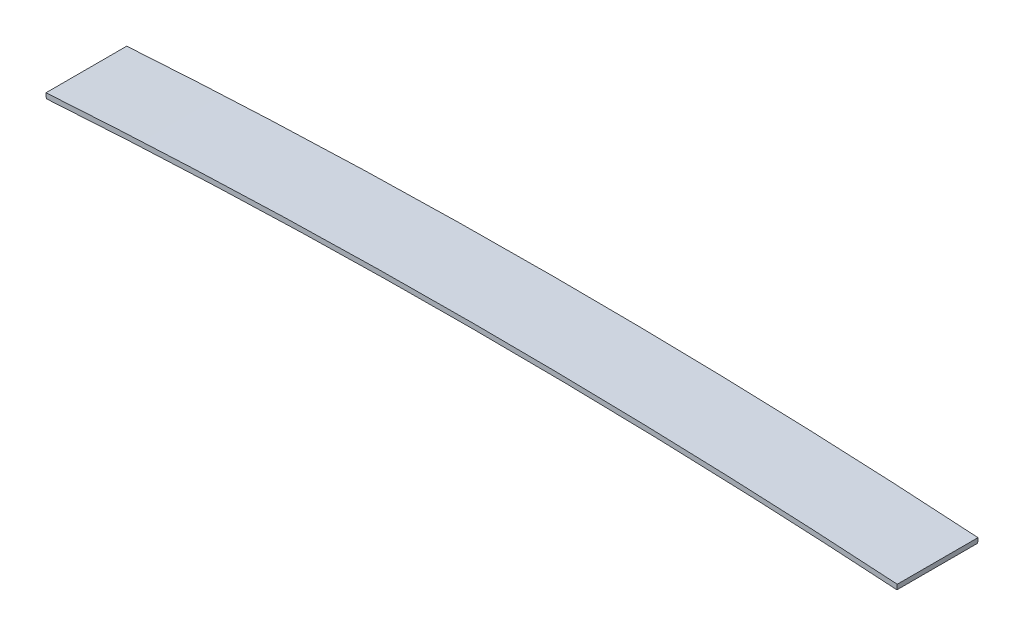
ISO-10303-21;
HEADER;
FILE_DESCRIPTION(('STEP AP214'),'2;1');
FILE_NAME('part.step','',(''),(''),'','','');
FILE_SCHEMA(('AUTOMOTIVE_DESIGN { 1 0 10303 214 1 1 1 1 }'));
ENDSEC;
DATA;
#1=APPLICATION_CONTEXT('core data for automotive mechanical design processes');
#2=APPLICATION_PROTOCOL_DEFINITION('international standard','automotive_design',2000,#1);
#3=PRODUCT_CONTEXT('',#1,'mechanical');
#4=PRODUCT('Part','Part','',(#3));
#5=PRODUCT_RELATED_PRODUCT_CATEGORY('part','',(#4));
#6=PRODUCT_DEFINITION_FORMATION('','',#4);
#7=PRODUCT_DEFINITION_CONTEXT('part definition',#1,'design');
#8=PRODUCT_DEFINITION('design','',#6,#7);
#9=PRODUCT_DEFINITION_SHAPE('','',#8);
#10=(LENGTH_UNIT() NAMED_UNIT(*) SI_UNIT(.MILLI.,.METRE.));
#11=(NAMED_UNIT(*) PLANE_ANGLE_UNIT() SI_UNIT($,.RADIAN.));
#12=(NAMED_UNIT(*) SI_UNIT($,.STERADIAN.) SOLID_ANGLE_UNIT());
#13=UNCERTAINTY_MEASURE_WITH_UNIT(LENGTH_MEASURE(1.E-05),#10,'distance_accuracy_value','');
#14=(GEOMETRIC_REPRESENTATION_CONTEXT(3) GLOBAL_UNCERTAINTY_ASSIGNED_CONTEXT((#13)) GLOBAL_UNIT_ASSIGNED_CONTEXT((#10,
#11,#12)) REPRESENTATION_CONTEXT('',''));
#15=CARTESIAN_POINT('',(0.,0.,0.));
#16=DIRECTION('',(0.,0.,1.));
#17=DIRECTION('',(1.,0.,0.));
#18=AXIS2_PLACEMENT_3D('',#15,#16,#17);
#19=CARTESIAN_POINT('',(0.,0.,-8.));
#20=CARTESIAN_POINT('',(28.099304307425,1.84237579528462,-8.));
#21=CARTESIAN_POINT('',(56.1984685840656,1.8423757953029,-8.));
#22=CARTESIAN_POINT('',(84.2977728915,0.,-8.));
#23=B_SPLINE_CURVE_WITH_KNOTS('',3,(#19,#20,#21,#22),.UNSPECIFIED.,.F.,.F.,(4,4),(0.,1.),.UNSPECIFIED.);
#24=DIRECTION('',(0.,0.,1.));
#25=VECTOR('',#24,1.);
#26=SURFACE_OF_LINEAR_EXTRUSION('',#23,#25);
#27=CARTESIAN_POINT('',(0.,0.,0.));
#28=CARTESIAN_POINT('',(28.099304307425,1.84237579528462,0.));
#29=CARTESIAN_POINT('',(56.1984685840656,1.8423757953029,0.));
#30=CARTESIAN_POINT('',(84.2977728915,0.,0.));
#31=B_SPLINE_CURVE_WITH_KNOTS('',3,(#27,#28,#29,#30),.UNSPECIFIED.,.F.,.F.,(4,4),(0.,1.),.UNSPECIFIED.);
#32=CARTESIAN_POINT('',(0.,0.,0.));
#33=VERTEX_POINT('',#32);
#34=CARTESIAN_POINT('',(84.2977728915,0.,0.));
#35=VERTEX_POINT('',#34);
#36=EDGE_CURVE('E124',#33,#35,#31,.T.);
#37=ORIENTED_EDGE('',*,*,#36,.F.);
#38=DIRECTION('',(0.,0.,1.));
#39=VECTOR('',#38,1.);
#40=CARTESIAN_POINT('',(0.,0.,-8.));
#41=LINE('',#40,#39);
#42=CARTESIAN_POINT('',(0.,0.,-8.));
#43=VERTEX_POINT('',#42);
#44=EDGE_CURVE('E11',#43,#33,#41,.T.);
#45=ORIENTED_EDGE('',*,*,#44,.F.);
#46=CARTESIAN_POINT('',(84.2977728915,0.,-8.));
#47=VERTEX_POINT('',#46);
#48=EDGE_CURVE('E94',#43,#47,#23,.T.);
#49=ORIENTED_EDGE('',*,*,#48,.T.);
#50=DIRECTION('',(0.,0.,1.));
#51=VECTOR('',#50,1.);
#52=CARTESIAN_POINT('',(84.2977728915,0.,-8.));
#53=LINE('',#52,#51);
#54=EDGE_CURVE('E39',#47,#35,#53,.T.);
#55=ORIENTED_EDGE('',*,*,#54,.T.);
#56=EDGE_LOOP('',(#37,#45,#49,#55));
#57=FACE_BOUND('',#56,.T.);
#58=ADVANCED_FACE('F35',(#57),#26,.T.);
#59=CARTESIAN_POINT('',(-0.0327130580999868,0.4989287081,-8.));
#60=DIRECTION('',(-0.997857416326552,-0.0654261162082712,0.));
#61=DIRECTION('',(0.0654261162082712,-0.997857416326552,0.));
#62=AXIS2_PLACEMENT_3D('',#59,#60,#61);
#63=PLANE('',#62);
#64=DIRECTION('',(0.0654261162082712,-0.997857416326552,0.));
#65=VECTOR('',#64,1.);
#66=CARTESIAN_POINT('',(-0.0327130580999868,0.4989287081,0.));
#67=LINE('',#66,#65);
#68=CARTESIAN_POINT('',(-0.0327130580999868,0.4989287081,0.));
#69=VERTEX_POINT('',#68);
#70=EDGE_CURVE('E96',#69,#33,#67,.T.);
#71=ORIENTED_EDGE('',*,*,#70,.F.);
#72=DIRECTION('',(0.,0.,1.));
#73=VECTOR('',#72,1.);
#74=CARTESIAN_POINT('',(-0.0327130580999868,0.4989287081,-8.));
#75=LINE('',#74,#73);
#76=CARTESIAN_POINT('',(-0.0327130580999868,0.4989287081,-8.));
#77=VERTEX_POINT('',#76);
#78=EDGE_CURVE('E45',#77,#69,#75,.T.);
#79=ORIENTED_EDGE('',*,*,#78,.F.);
#80=DIRECTION('',(0.0654261162082712,-0.997857416326552,0.));
#81=VECTOR('',#80,1.);
#82=CARTESIAN_POINT('',(-0.0327130580999868,0.4989287081,-8.));
#83=LINE('',#82,#81);
#84=EDGE_CURVE('E91',#77,#43,#83,.T.);
#85=ORIENTED_EDGE('',*,*,#84,.T.);
#86=ORIENTED_EDGE('',*,*,#44,.T.);
#87=EDGE_LOOP('',(#71,#79,#85,#86));
#88=FACE_BOUND('',#87,.T.);
#89=ADVANCED_FACE('F111',(#88),#63,.T.);
#90=CARTESIAN_POINT('',(84.3304859496,0.49892870819999,-8.));
#91=CARTESIAN_POINT('',(56.2094662906147,2.34272830519641,-8.));
#92=CARTESIAN_POINT('',(28.0883066008751,2.34272830517812,-8.));
#93=CARTESIAN_POINT('',(-0.0327130580999868,0.498928708100001,-8.));
#94=B_SPLINE_CURVE_WITH_KNOTS('',3,(#90,#91,#92,#93),.UNSPECIFIED.,.F.,.F.,(4,4),(0.,1.),.UNSPECIFIED.);
#95=DIRECTION('',(0.,0.,1.));
#96=VECTOR('',#95,1.);
#97=SURFACE_OF_LINEAR_EXTRUSION('',#94,#96);
#98=CARTESIAN_POINT('',(84.3304859496,0.49892870819999,0.));
#99=CARTESIAN_POINT('',(56.2094662906147,2.34272830519641,0.));
#100=CARTESIAN_POINT('',(28.0883066008751,2.34272830517812,0.));
#101=CARTESIAN_POINT('',(-0.0327130580999868,0.498928708100001,0.));
#102=B_SPLINE_CURVE_WITH_KNOTS('',3,(#98,#99,#100,#101),.UNSPECIFIED.,.F.,.F.,(4,4),(0.,1.),.UNSPECIFIED.);
#103=CARTESIAN_POINT('',(84.3304859496,0.49892870819999,0.));
#104=VERTEX_POINT('',#103);
#105=EDGE_CURVE('E86',#104,#69,#102,.T.);
#106=ORIENTED_EDGE('',*,*,#105,.F.);
#107=DIRECTION('',(0.,0.,1.));
#108=VECTOR('',#107,1.);
#109=CARTESIAN_POINT('',(84.3304859496,0.49892870819999,-8.));
#110=LINE('',#109,#108);
#111=CARTESIAN_POINT('',(84.3304859496,0.49892870819999,-8.));
#112=VERTEX_POINT('',#111);
#113=EDGE_CURVE('E81',#112,#104,#110,.T.);
#114=ORIENTED_EDGE('',*,*,#113,.F.);
#115=EDGE_CURVE('E84',#112,#77,#94,.T.);
#116=ORIENTED_EDGE('',*,*,#115,.T.);
#117=ORIENTED_EDGE('',*,*,#78,.T.);
#118=EDGE_LOOP('',(#106,#114,#116,#117));
#119=FACE_BOUND('',#118,.T.);
#120=ADVANCED_FACE('F83',(#119),#97,.T.);
#121=CARTESIAN_POINT('',(84.2977728915,0.,-8.));
#122=DIRECTION('',(0.997857416327408,-0.0654261161952141,0.));
#123=DIRECTION('',(0.0654261161952141,0.997857416327408,0.));
#124=AXIS2_PLACEMENT_3D('',#121,#122,#123);
#125=PLANE('',#124);
#126=DIRECTION('',(0.0654261161952141,0.997857416327408,0.));
#127=VECTOR('',#126,1.);
#128=CARTESIAN_POINT('',(84.2977728915,0.,0.));
#129=LINE('',#128,#127);
#130=EDGE_CURVE('E127',#35,#104,#129,.T.);
#131=ORIENTED_EDGE('',*,*,#130,.F.);
#132=ORIENTED_EDGE('',*,*,#54,.F.);
#133=DIRECTION('',(0.0654261161952141,0.997857416327408,0.));
#134=VECTOR('',#133,1.);
#135=CARTESIAN_POINT('',(84.2977728915,0.,-8.));
#136=LINE('',#135,#134);
#137=EDGE_CURVE('E90',#47,#112,#136,.T.);
#138=ORIENTED_EDGE('',*,*,#137,.T.);
#139=ORIENTED_EDGE('',*,*,#113,.T.);
#140=EDGE_LOOP('',(#131,#132,#138,#139));
#141=FACE_BOUND('',#140,.T.);
#142=ADVANCED_FACE('F93',(#141),#125,.T.);
#143=CARTESIAN_POINT('',(42.1488864457465,1.38178184647032,-8.));
#144=DIRECTION('',(0.,0.,1.));
#145=DIRECTION('',(1.,0.,0.));
#146=AXIS2_PLACEMENT_3D('',#143,#144,#145);
#147=PLANE('',#146);
#148=ORIENTED_EDGE('',*,*,#48,.F.);
#149=ORIENTED_EDGE('',*,*,#84,.F.);
#150=ORIENTED_EDGE('',*,*,#115,.F.);
#151=ORIENTED_EDGE('',*,*,#137,.F.);
#152=EDGE_LOOP('',(#148,#149,#150,#151));
#153=FACE_BOUND('',#152,.T.);
#154=ADVANCED_FACE('F89',(#153),#147,.F.);
#155=CARTESIAN_POINT('',(42.1488864457465,1.38178184647032,0.));
#156=DIRECTION('',(0.,0.,1.));
#157=DIRECTION('',(1.,0.,0.));
#158=AXIS2_PLACEMENT_3D('',#155,#156,#157);
#159=PLANE('',#158);
#160=ORIENTED_EDGE('',*,*,#36,.T.);
#161=ORIENTED_EDGE('',*,*,#130,.T.);
#162=ORIENTED_EDGE('',*,*,#105,.T.);
#163=ORIENTED_EDGE('',*,*,#70,.T.);
#164=EDGE_LOOP('',(#160,#161,#162,#163));
#165=FACE_BOUND('',#164,.T.);
#166=ADVANCED_FACE('F117',(#165),#159,.T.);
#167=CLOSED_SHELL('',(#58,#89,#120,#142,#154,#166));
#168=MANIFOLD_SOLID_BREP('B2',#167);
#169=ADVANCED_BREP_SHAPE_REPRESENTATION('',(#18,#168),#14);
#170=SHAPE_DEFINITION_REPRESENTATION(#9,#169);
ENDSEC;
END-ISO-10303-21;
